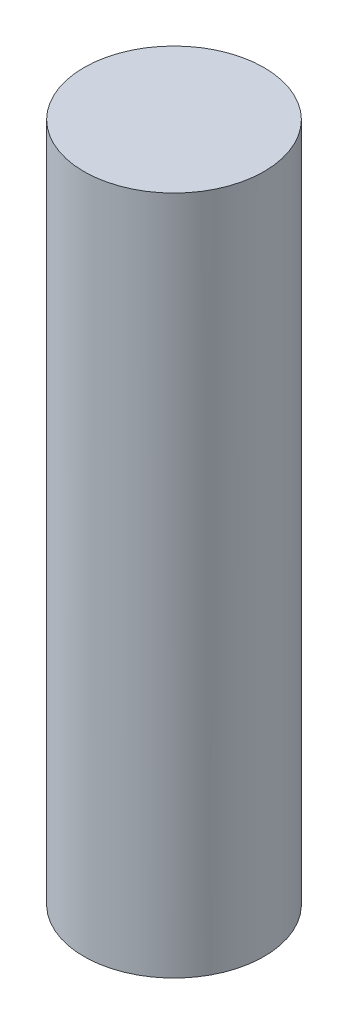
ISO-10303-21;
HEADER;
FILE_DESCRIPTION(('STEP AP214'),'2;1');
FILE_NAME('part.step','',(''),(''),'','','');
FILE_SCHEMA(('AUTOMOTIVE_DESIGN { 1 0 10303 214 1 1 1 1 }'));
ENDSEC;
DATA;
#1=APPLICATION_CONTEXT('core data for automotive mechanical design processes');
#2=APPLICATION_PROTOCOL_DEFINITION('international standard','automotive_design',2000,#1);
#3=PRODUCT_CONTEXT('',#1,'mechanical');
#4=PRODUCT('Part','Part','',(#3));
#5=PRODUCT_RELATED_PRODUCT_CATEGORY('part','',(#4));
#6=PRODUCT_DEFINITION_FORMATION('','',#4);
#7=PRODUCT_DEFINITION_CONTEXT('part definition',#1,'design');
#8=PRODUCT_DEFINITION('design','',#6,#7);
#9=PRODUCT_DEFINITION_SHAPE('','',#8);
#10=(LENGTH_UNIT() NAMED_UNIT(*) SI_UNIT(.MILLI.,.METRE.));
#11=(NAMED_UNIT(*) PLANE_ANGLE_UNIT() SI_UNIT($,.RADIAN.));
#12=(NAMED_UNIT(*) SI_UNIT($,.STERADIAN.) SOLID_ANGLE_UNIT());
#13=UNCERTAINTY_MEASURE_WITH_UNIT(LENGTH_MEASURE(1.E-05),#10,'distance_accuracy_value','');
#14=(GEOMETRIC_REPRESENTATION_CONTEXT(3) GLOBAL_UNCERTAINTY_ASSIGNED_CONTEXT((#13)) GLOBAL_UNIT_ASSIGNED_CONTEXT((#10,
#11,#12)) REPRESENTATION_CONTEXT('',''));
#15=CARTESIAN_POINT('',(0.,0.,0.));
#16=DIRECTION('',(0.,0.,1.));
#17=DIRECTION('',(1.,0.,0.));
#18=AXIS2_PLACEMENT_3D('',#15,#16,#17);
#19=CARTESIAN_POINT('',(0.,100.,0.));
#20=DIRECTION('',(0.,-1.,0.));
#21=DIRECTION('',(0.,0.,-1.));
#22=AXIS2_PLACEMENT_3D('',#19,#20,#21);
#23=CYLINDRICAL_SURFACE('',#22,13.25);
#24=CARTESIAN_POINT('',(0.,100.,0.));
#25=DIRECTION('',(0.,1.,0.));
#26=DIRECTION('',(0.,0.,1.));
#27=AXIS2_PLACEMENT_3D('',#24,#25,#26);
#28=CIRCLE('',#27,13.25);
#29=CARTESIAN_POINT('',(0.,100.,13.25));
#30=VERTEX_POINT('',#29);
#31=EDGE_CURVE('E10',#30,#30,#28,.T.);
#32=ORIENTED_EDGE('',*,*,#31,.F.);
#33=EDGE_LOOP('',(#32));
#34=FACE_BOUND('',#33,.T.);
#35=CARTESIAN_POINT('',(0.,0.,0.));
#36=DIRECTION('',(0.,-1.,0.));
#37=DIRECTION('',(0.,0.,-1.));
#38=AXIS2_PLACEMENT_3D('',#35,#36,#37);
#39=CIRCLE('',#38,13.25);
#40=CARTESIAN_POINT('',(0.,0.,-13.25));
#41=VERTEX_POINT('',#40);
#42=EDGE_CURVE('E50',#41,#41,#39,.T.);
#43=ORIENTED_EDGE('',*,*,#42,.F.);
#44=EDGE_LOOP('',(#43));
#45=FACE_BOUND('',#44,.T.);
#46=ADVANCED_FACE('F43',(#34,#45),#23,.T.);
#47=CARTESIAN_POINT('',(0.,100.,0.));
#48=DIRECTION('',(0.,1.,0.));
#49=DIRECTION('',(0.,0.,1.));
#50=AXIS2_PLACEMENT_3D('',#47,#48,#49);
#51=PLANE('',#50);
#52=ORIENTED_EDGE('',*,*,#31,.T.);
#53=EDGE_LOOP('',(#52));
#54=FACE_BOUND('',#53,.T.);
#55=ADVANCED_FACE('F60',(#54),#51,.T.);
#56=CARTESIAN_POINT('',(0.,27.7604166666667,0.));
#57=DIRECTION('',(0.,-1.,0.));
#58=DIRECTION('',(-1.,0.,0.));
#59=AXIS2_PLACEMENT_3D('',#56,#57,#58);
#60=SPHERICAL_SURFACE('',#59,30.7604166666667);
#61=ORIENTED_EDGE('',*,*,#42,.T.);
#62=EDGE_LOOP('',(#61));
#63=FACE_BOUND('',#62,.T.);
#64=ADVANCED_FACE('F57',(#63),#60,.T.);
#65=CLOSED_SHELL('',(#46,#55,#64));
#66=MANIFOLD_SOLID_BREP('B2',#65);
#67=ADVANCED_BREP_SHAPE_REPRESENTATION('',(#18,#66),#14);
#68=SHAPE_DEFINITION_REPRESENTATION(#9,#67);
ENDSEC;
END-ISO-10303-21;
